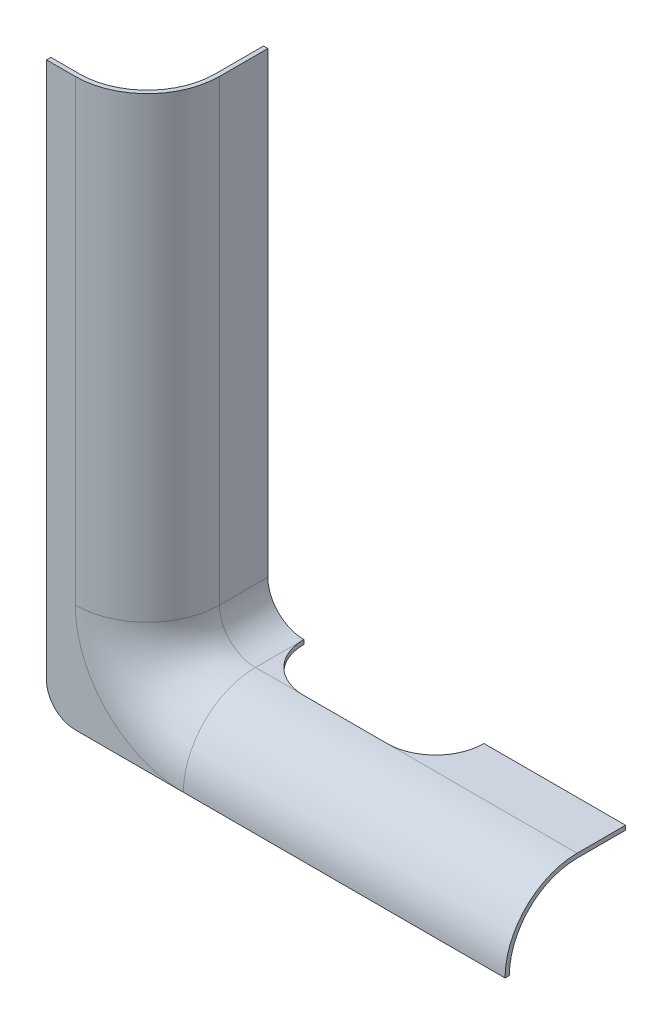
ISO-10303-21;
HEADER;
FILE_DESCRIPTION(('STEP AP214'),'2;1');
FILE_NAME('part.step','',(''),(''),'','','');
FILE_SCHEMA(('AUTOMOTIVE_DESIGN { 1 0 10303 214 1 1 1 1 }'));
ENDSEC;
DATA;
#1=APPLICATION_CONTEXT('core data for automotive mechanical design processes');
#2=APPLICATION_PROTOCOL_DEFINITION('international standard','automotive_design',2000,#1);
#3=PRODUCT_CONTEXT('',#1,'mechanical');
#4=PRODUCT('Part','Part','',(#3));
#5=PRODUCT_RELATED_PRODUCT_CATEGORY('part','',(#4));
#6=PRODUCT_DEFINITION_FORMATION('','',#4);
#7=PRODUCT_DEFINITION_CONTEXT('part definition',#1,'design');
#8=PRODUCT_DEFINITION('design','',#6,#7);
#9=PRODUCT_DEFINITION_SHAPE('','',#8);
#10=(LENGTH_UNIT() NAMED_UNIT(*) SI_UNIT(.MILLI.,.METRE.));
#11=(NAMED_UNIT(*) PLANE_ANGLE_UNIT() SI_UNIT($,.RADIAN.));
#12=(NAMED_UNIT(*) SI_UNIT($,.STERADIAN.) SOLID_ANGLE_UNIT());
#13=UNCERTAINTY_MEASURE_WITH_UNIT(LENGTH_MEASURE(1.E-05),#10,'distance_accuracy_value','');
#14=(GEOMETRIC_REPRESENTATION_CONTEXT(3) GLOBAL_UNCERTAINTY_ASSIGNED_CONTEXT((#13)) GLOBAL_UNIT_ASSIGNED_CONTEXT((#10,
#11,#12)) REPRESENTATION_CONTEXT('',''));
#15=CARTESIAN_POINT('',(0.,0.,0.));
#16=DIRECTION('',(0.,0.,1.));
#17=DIRECTION('',(1.,0.,0.));
#18=AXIS2_PLACEMENT_3D('',#15,#16,#17);
#19=CARTESIAN_POINT('',(46.5590634304441,-724.702863061255,33.4500000000002));
#20=DIRECTION('',(0.,-1.,0.));
#21=DIRECTION('',(0.,0.,-1.));
#22=AXIS2_PLACEMENT_3D('',#19,#20,#21);
#23=PLANE('',#22);
#24=DIRECTION('',(-1.,0.,0.));
#25=VECTOR('',#24,1.);
#26=CARTESIAN_POINT('',(46.5590634304441,-724.702863061255,0.));
#27=LINE('',#26,#25);
#28=CARTESIAN_POINT('',(46.5590634304441,-724.702863061255,0.));
#29=VERTEX_POINT('',#28);
#30=CARTESIAN_POINT('',(7.26848491782996,-724.702863061255,0.));
#31=VERTEX_POINT('',#30);
#32=EDGE_CURVE('E182',#29,#31,#27,.T.);
#33=ORIENTED_EDGE('',*,*,#32,.T.);
#34=CARTESIAN_POINT('',(-6.18151508217022,-724.702863061255,0.));
#35=DIRECTION('',(0.,1.,0.));
#36=DIRECTION('',(0.,0.,1.));
#37=AXIS2_PLACEMENT_3D('',#34,#35,#36);
#38=CIRCLE('',#37,13.4500000000002);
#39=CARTESIAN_POINT('',(-6.18151508217022,-724.702863061255,13.4500000000002));
#40=VERTEX_POINT('',#39);
#41=EDGE_CURVE('E162',#40,#31,#38,.T.);
#42=ORIENTED_EDGE('',*,*,#41,.F.);
#43=DIRECTION('',(-1.,0.,0.));
#44=VECTOR('',#43,1.);
#45=CARTESIAN_POINT('',(46.5590634304441,-724.702863061255,13.4500000000002));
#46=LINE('',#45,#44);
#47=CARTESIAN_POINT('',(46.5590634304441,-724.702863061255,13.4500000000002));
#48=VERTEX_POINT('',#47);
#49=EDGE_CURVE('E60',#40,#48,#46,.F.);
#50=ORIENTED_EDGE('',*,*,#49,.T.);
#51=DIRECTION('',(0.,0.,-1.));
#52=VECTOR('',#51,1.);
#53=CARTESIAN_POINT('',(46.5590634304441,-724.702863061255,33.4500000000002));
#54=LINE('',#53,#52);
#55=EDGE_CURVE('E276',#48,#29,#54,.T.);
#56=ORIENTED_EDGE('',*,*,#55,.T.);
#57=EDGE_LOOP('',(#33,#42,#50,#56));
#58=FACE_BOUND('',#57,.T.);
#59=ADVANCED_FACE('F35',(#58),#23,.F.);
#60=CARTESIAN_POINT('',(-72.73151508217,-736.702863061255,0.));
#61=DIRECTION('',(0.,0.,1.));
#62=DIRECTION('',(1.,0.,0.));
#63=AXIS2_PLACEMENT_3D('',#60,#61,#62);
#64=PLANE('',#63);
#65=DIRECTION('',(-1.,0.,0.));
#66=VECTOR('',#65,1.);
#67=CARTESIAN_POINT('',(46.5590634304441,-725.902863061255,0.));
#68=LINE('',#67,#66);
#69=CARTESIAN_POINT('',(46.5590634304441,-725.902863061255,0.));
#70=VERTEX_POINT('',#69);
#71=CARTESIAN_POINT('',(7.26848491782996,-725.902863061255,0.));
#72=VERTEX_POINT('',#71);
#73=EDGE_CURVE('E235',#70,#72,#68,.T.);
#74=ORIENTED_EDGE('',*,*,#73,.T.);
#75=DIRECTION('',(0.,1.,0.));
#76=VECTOR('',#75,1.);
#77=CARTESIAN_POINT('',(7.26848491782996,-782.679706932678,0.));
#78=LINE('',#77,#76);
#79=EDGE_CURVE('E340',#72,#31,#78,.T.);
#80=ORIENTED_EDGE('',*,*,#79,.T.);
#81=ORIENTED_EDGE('',*,*,#32,.F.);
#82=DIRECTION('',(0.,1.,0.));
#83=VECTOR('',#82,1.);
#84=CARTESIAN_POINT('',(46.5590634304441,-744.702863061255,0.));
#85=LINE('',#84,#83);
#86=EDGE_CURVE('E199',#70,#29,#85,.T.);
#87=ORIENTED_EDGE('',*,*,#86,.F.);
#88=EDGE_LOOP('',(#74,#80,#81,#87));
#89=FACE_BOUND('',#88,.T.);
#90=ADVANCED_FACE('F339',(#89),#64,.F.);
#91=CARTESIAN_POINT('',(46.5590634304441,-725.902863061255,33.4500000000002));
#92=DIRECTION('',(0.,-1.,0.));
#93=DIRECTION('',(0.,0.,-1.));
#94=AXIS2_PLACEMENT_3D('',#91,#92,#93);
#95=PLANE('',#94);
#96=CARTESIAN_POINT('',(-6.18151508217022,-725.902863061255,0.));
#97=DIRECTION('',(0.,-1.,0.));
#98=DIRECTION('',(0.,0.,-1.));
#99=AXIS2_PLACEMENT_3D('',#96,#97,#98);
#100=CIRCLE('',#99,13.4500000000002);
#101=CARTESIAN_POINT('',(-6.18151508217023,-725.902863061255,13.4500000000002));
#102=VERTEX_POINT('',#101);
#103=EDGE_CURVE('E165',#102,#72,#100,.F.);
#104=ORIENTED_EDGE('',*,*,#103,.T.);
#105=ORIENTED_EDGE('',*,*,#73,.F.);
#106=DIRECTION('',(0.,0.,-1.));
#107=VECTOR('',#106,1.);
#108=CARTESIAN_POINT('',(46.5590634304441,-725.902863061255,33.4500000000002));
#109=LINE('',#108,#107);
#110=CARTESIAN_POINT('',(46.5590634304441,-725.902863061255,13.4500000000002));
#111=VERTEX_POINT('',#110);
#112=EDGE_CURVE('E210',#111,#70,#109,.T.);
#113=ORIENTED_EDGE('',*,*,#112,.F.);
#114=DIRECTION('',(1.,0.,0.));
#115=VECTOR('',#114,1.);
#116=CARTESIAN_POINT('',(46.5590634304441,-725.902863061255,13.4500000000002));
#117=LINE('',#116,#115);
#118=EDGE_CURVE('E206',#102,#111,#117,.T.);
#119=ORIENTED_EDGE('',*,*,#118,.F.);
#120=EDGE_LOOP('',(#104,#105,#113,#119));
#121=FACE_BOUND('',#120,.T.);
#122=ADVANCED_FACE('F387',(#121),#95,.T.);
#123=CARTESIAN_POINT('',(46.5590634304441,-744.702863061255,33.4500000000002));
#124=DIRECTION('',(-1.,0.,0.));
#125=DIRECTION('',(0.,0.,1.));
#126=AXIS2_PLACEMENT_3D('',#123,#124,#125);
#127=PLANE('',#126);
#128=CARTESIAN_POINT('',(46.5590634304441,-744.702863061255,13.4500000000002));
#129=DIRECTION('',(-1.,0.,0.));
#130=DIRECTION('',(0.,0.,1.));
#131=AXIS2_PLACEMENT_3D('',#128,#129,#130);
#132=CIRCLE('',#131,18.8);
#133=CARTESIAN_POINT('',(46.5590634304441,-744.702863061255,32.2500000000002));
#134=VERTEX_POINT('',#133);
#135=EDGE_CURVE('E193',#111,#134,#132,.F.);
#136=ORIENTED_EDGE('',*,*,#135,.F.);
#137=ORIENTED_EDGE('',*,*,#112,.T.);
#138=ORIENTED_EDGE('',*,*,#86,.T.);
#139=ORIENTED_EDGE('',*,*,#55,.F.);
#140=CARTESIAN_POINT('',(46.5590634304441,-744.702863061255,13.4500000000002));
#141=DIRECTION('',(-1.,0.,0.));
#142=DIRECTION('',(0.,0.,1.));
#143=AXIS2_PLACEMENT_3D('',#140,#141,#142);
#144=CIRCLE('',#143,20.);
#145=CARTESIAN_POINT('',(46.5590634304441,-744.702863061255,33.4500000000002));
#146=VERTEX_POINT('',#145);
#147=EDGE_CURVE('E11',#48,#146,#144,.F.);
#148=ORIENTED_EDGE('',*,*,#147,.T.);
#149=DIRECTION('',(0.,0.,-1.));
#150=VECTOR('',#149,1.);
#151=CARTESIAN_POINT('',(46.5590634304441,-744.702863061255,33.4500000000002));
#152=LINE('',#151,#150);
#153=EDGE_CURVE('E255',#146,#134,#152,.T.);
#154=ORIENTED_EDGE('',*,*,#153,.T.);
#155=EDGE_LOOP('',(#136,#137,#138,#139,#148,#154));
#156=FACE_BOUND('',#155,.T.);
#157=ADVANCED_FACE('F335',(#156),#127,.F.);
#158=CARTESIAN_POINT('',(-42.73151508217,-724.702863061255,13.4500000000002));
#159=VERTEX_POINT('',#158);
#160=CARTESIAN_POINT('',(-29.2815150821699,-724.702863061255,13.4500000000002));
#161=VERTEX_POINT('',#160);
#162=EDGE_CURVE('E44',#159,#161,#46,.F.);
#163=ORIENTED_EDGE('',*,*,#162,.T.);
#164=CARTESIAN_POINT('',(-29.2815150821699,-724.702863061255,0.));
#165=DIRECTION('',(0.,1.,0.));
#166=DIRECTION('',(0.,0.,1.));
#167=AXIS2_PLACEMENT_3D('',#164,#165,#166);
#168=CIRCLE('',#167,13.4500000000002);
#169=CARTESIAN_POINT('',(-42.73151508217,-724.702863061255,0.));
#170=VERTEX_POINT('',#169);
#171=EDGE_CURVE('E178',#170,#161,#168,.T.);
#172=ORIENTED_EDGE('',*,*,#171,.F.);
#173=DIRECTION('',(0.,0.,-1.));
#174=VECTOR('',#173,1.);
#175=CARTESIAN_POINT('',(-42.73151508217,-724.702863061255,33.4500000000002));
#176=LINE('',#175,#174);
#177=EDGE_CURVE('E280',#170,#159,#176,.F.);
#178=ORIENTED_EDGE('',*,*,#177,.T.);
#179=EDGE_LOOP('',(#163,#172,#178));
#180=FACE_BOUND('',#179,.T.);
#181=ADVANCED_FACE('F308',(#180),#23,.F.);
#182=CARTESIAN_POINT('',(-52.73151508217,-724.702863061255,33.4500000000002));
#183=DIRECTION('',(-1.,0.,0.));
#184=DIRECTION('',(0.,0.,1.));
#185=AXIS2_PLACEMENT_3D('',#182,#183,#184);
#186=PLANE('',#185);
#187=DIRECTION('',(0.,0.,-1.));
#188=VECTOR('',#187,1.);
#189=CARTESIAN_POINT('',(-52.73151508217,-587.62723977428,33.4500000000002));
#190=LINE('',#189,#188);
#191=CARTESIAN_POINT('',(-52.73151508217,-587.62723977428,13.4500000000002));
#192=VERTEX_POINT('',#191);
#193=CARTESIAN_POINT('',(-52.73151508217,-587.62723977428,0.));
#194=VERTEX_POINT('',#193);
#195=EDGE_CURVE('E274',#192,#194,#190,.T.);
#196=ORIENTED_EDGE('',*,*,#195,.F.);
#197=DIRECTION('',(0.,1.,0.));
#198=VECTOR('',#197,1.);
#199=CARTESIAN_POINT('',(-52.73151508217,-714.702863061255,13.4500000000002));
#200=LINE('',#199,#198);
#201=CARTESIAN_POINT('',(-52.73151508217,-714.702863061255,13.4500000000002));
#202=VERTEX_POINT('',#201);
#203=EDGE_CURVE('E188',#192,#202,#200,.F.);
#204=ORIENTED_EDGE('',*,*,#203,.T.);
#205=DIRECTION('',(0.,0.,-1.));
#206=VECTOR('',#205,1.);
#207=CARTESIAN_POINT('',(-52.73151508217,-714.702863061255,0.));
#208=LINE('',#207,#206);
#209=CARTESIAN_POINT('',(-52.73151508217,-714.702863061255,0.));
#210=VERTEX_POINT('',#209);
#211=EDGE_CURVE('E278',#202,#210,#208,.T.);
#212=ORIENTED_EDGE('',*,*,#211,.T.);
#213=DIRECTION('',(0.,1.,0.));
#214=VECTOR('',#213,1.);
#215=CARTESIAN_POINT('',(-52.73151508217,-724.702863061255,0.));
#216=LINE('',#215,#214);
#217=EDGE_CURVE('E258',#210,#194,#216,.T.);
#218=ORIENTED_EDGE('',*,*,#217,.T.);
#219=EDGE_LOOP('',(#196,#204,#212,#218));
#220=FACE_BOUND('',#219,.T.);
#221=ADVANCED_FACE('F295',(#220),#186,.F.);
#222=CARTESIAN_POINT('',(-80.73151508217,-587.62723977428,33.4500000000002));
#223=DIRECTION('',(0.,-1.,0.));
#224=DIRECTION('',(0.,0.,-1.));
#225=AXIS2_PLACEMENT_3D('',#222,#223,#224);
#226=PLANE('',#225);
#227=CARTESIAN_POINT('',(-72.73151508217,-587.62723977428,13.4500000000002));
#228=DIRECTION('',(0.,-1.,0.));
#229=DIRECTION('',(0.,0.,-1.));
#230=AXIS2_PLACEMENT_3D('',#227,#228,#229);
#231=CIRCLE('',#230,18.8);
#232=CARTESIAN_POINT('',(-72.73151508217,-587.62723977428,32.2500000000002));
#233=VERTEX_POINT('',#232);
#234=CARTESIAN_POINT('',(-53.93151508217,-587.62723977428,13.4500000000002));
#235=VERTEX_POINT('',#234);
#236=EDGE_CURVE('E228',#233,#235,#231,.F.);
#237=ORIENTED_EDGE('',*,*,#236,.F.);
#238=DIRECTION('',(-1.,0.,0.));
#239=VECTOR('',#238,1.);
#240=CARTESIAN_POINT('',(-80.73151508217,-587.62723977428,32.2500000000002));
#241=LINE('',#240,#239);
#242=CARTESIAN_POINT('',(-80.73151508217,-587.62723977428,32.2500000000002));
#243=VERTEX_POINT('',#242);
#244=EDGE_CURVE('E224',#233,#243,#241,.T.);
#245=ORIENTED_EDGE('',*,*,#244,.T.);
#246=DIRECTION('',(0.,0.,-1.));
#247=VECTOR('',#246,1.);
#248=CARTESIAN_POINT('',(-80.73151508217,-587.62723977428,33.4500000000002));
#249=LINE('',#248,#247);
#250=CARTESIAN_POINT('',(-80.73151508217,-587.62723977428,33.4500000000002));
#251=VERTEX_POINT('',#250);
#252=EDGE_CURVE('E271',#251,#243,#249,.T.);
#253=ORIENTED_EDGE('',*,*,#252,.F.);
#254=DIRECTION('',(-1.,0.,0.));
#255=VECTOR('',#254,1.);
#256=CARTESIAN_POINT('',(-80.73151508217,-587.62723977428,33.4500000000002));
#257=LINE('',#256,#255);
#258=CARTESIAN_POINT('',(-72.73151508217,-587.62723977428,33.4500000000002));
#259=VERTEX_POINT('',#258);
#260=EDGE_CURVE('E244',#259,#251,#257,.T.);
#261=ORIENTED_EDGE('',*,*,#260,.F.);
#262=CARTESIAN_POINT('',(-72.73151508217,-587.62723977428,13.4500000000002));
#263=DIRECTION('',(0.,-1.,0.));
#264=DIRECTION('',(0.,0.,-1.));
#265=AXIS2_PLACEMENT_3D('',#262,#263,#264);
#266=CIRCLE('',#265,20.);
#267=EDGE_CURVE('E291',#259,#192,#266,.F.);
#268=ORIENTED_EDGE('',*,*,#267,.T.);
#269=ORIENTED_EDGE('',*,*,#195,.T.);
#270=DIRECTION('',(-1.,0.,0.));
#271=VECTOR('',#270,1.);
#272=CARTESIAN_POINT('',(-80.73151508217,-587.62723977428,0.));
#273=LINE('',#272,#271);
#274=CARTESIAN_POINT('',(-53.93151508217,-587.62723977428,0.));
#275=VERTEX_POINT('',#274);
#276=EDGE_CURVE('E247',#194,#275,#273,.T.);
#277=ORIENTED_EDGE('',*,*,#276,.T.);
#278=DIRECTION('',(0.,0.,-1.));
#279=VECTOR('',#278,1.);
#280=CARTESIAN_POINT('',(-53.93151508217,-587.62723977428,33.4500000000002));
#281=LINE('',#280,#279);
#282=EDGE_CURVE('E218',#235,#275,#281,.T.);
#283=ORIENTED_EDGE('',*,*,#282,.F.);
#284=EDGE_LOOP('',(#237,#245,#253,#261,#268,#269,#277,#283));
#285=FACE_BOUND('',#284,.T.);
#286=ADVANCED_FACE('F322',(#285),#226,.F.);
#287=CARTESIAN_POINT('',(-80.73151508217,-736.702863061255,33.4500000000002));
#288=DIRECTION('',(1.,0.,0.));
#289=DIRECTION('',(0.,0.,-1.));
#290=AXIS2_PLACEMENT_3D('',#287,#288,#289);
#291=PLANE('',#290);
#292=ORIENTED_EDGE('',*,*,#252,.T.);
#293=DIRECTION('',(0.,-1.,0.));
#294=VECTOR('',#293,1.);
#295=CARTESIAN_POINT('',(-80.73151508217,-736.702863061255,32.2500000000002));
#296=LINE('',#295,#294);
#297=CARTESIAN_POINT('',(-80.73151508217,-736.702863061255,32.2500000000002));
#298=VERTEX_POINT('',#297);
#299=EDGE_CURVE('E221',#243,#298,#296,.T.);
#300=ORIENTED_EDGE('',*,*,#299,.T.);
#301=DIRECTION('',(0.,0.,-1.));
#302=VECTOR('',#301,1.);
#303=CARTESIAN_POINT('',(-80.73151508217,-736.702863061255,33.4500000000002));
#304=LINE('',#303,#302);
#305=CARTESIAN_POINT('',(-80.73151508217,-736.702863061255,33.4500000000002));
#306=VERTEX_POINT('',#305);
#307=EDGE_CURVE('E268',#306,#298,#304,.T.);
#308=ORIENTED_EDGE('',*,*,#307,.F.);
#309=DIRECTION('',(0.,-1.,0.));
#310=VECTOR('',#309,1.);
#311=CARTESIAN_POINT('',(-80.73151508217,-736.702863061255,33.4500000000002));
#312=LINE('',#311,#310);
#313=EDGE_CURVE('E246',#251,#306,#312,.T.);
#314=ORIENTED_EDGE('',*,*,#313,.F.);
#315=EDGE_LOOP('',(#292,#300,#308,#314));
#316=FACE_BOUND('',#315,.T.);
#317=ADVANCED_FACE('F368',(#316),#291,.F.);
#318=CARTESIAN_POINT('',(-72.73151508217,-736.702863061255,33.4500000000002));
#319=DIRECTION('',(0.,0.,-1.));
#320=DIRECTION('',(-1.,0.,0.));
#321=AXIS2_PLACEMENT_3D('',#318,#319,#320);
#322=CYLINDRICAL_SURFACE('',#321,8.);
#323=ORIENTED_EDGE('',*,*,#307,.T.);
#324=CARTESIAN_POINT('',(-72.73151508217,-736.702863061255,32.2500000000002));
#325=DIRECTION('',(0.,0.,1.));
#326=DIRECTION('',(1.,0.,0.));
#327=AXIS2_PLACEMENT_3D('',#324,#325,#326);
#328=CIRCLE('',#327,8.);
#329=CARTESIAN_POINT('',(-72.7315150821701,-744.702863061255,32.2500000000002));
#330=VERTEX_POINT('',#329);
#331=EDGE_CURVE('E215',#298,#330,#328,.T.);
#332=ORIENTED_EDGE('',*,*,#331,.T.);
#333=DIRECTION('',(0.,0.,-1.));
#334=VECTOR('',#333,1.);
#335=CARTESIAN_POINT('',(-72.7315150821701,-744.702863061255,33.4500000000002));
#336=LINE('',#335,#334);
#337=CARTESIAN_POINT('',(-72.7315150821701,-744.702863061255,33.4500000000002));
#338=VERTEX_POINT('',#337);
#339=EDGE_CURVE('E265',#338,#330,#336,.T.);
#340=ORIENTED_EDGE('',*,*,#339,.F.);
#341=CARTESIAN_POINT('',(-72.73151508217,-736.702863061255,33.4500000000002));
#342=DIRECTION('',(0.,0.,1.));
#343=DIRECTION('',(1.,0.,0.));
#344=AXIS2_PLACEMENT_3D('',#341,#342,#343);
#345=CIRCLE('',#344,8.);
#346=EDGE_CURVE('E249',#306,#338,#345,.T.);
#347=ORIENTED_EDGE('',*,*,#346,.F.);
#348=EDGE_LOOP('',(#323,#332,#340,#347));
#349=FACE_BOUND('',#348,.T.);
#350=ADVANCED_FACE('F371',(#349),#322,.T.);
#351=CARTESIAN_POINT('',(46.5590634304441,-744.702863061255,33.4500000000002));
#352=DIRECTION('',(0.,1.,0.));
#353=DIRECTION('',(0.,0.,1.));
#354=AXIS2_PLACEMENT_3D('',#351,#352,#353);
#355=PLANE('',#354);
#356=DIRECTION('',(1.,0.,0.));
#357=VECTOR('',#356,1.);
#358=CARTESIAN_POINT('',(46.5590634304441,-744.702863061255,32.2500000000002));
#359=LINE('',#358,#357);
#360=CARTESIAN_POINT('',(-42.73151508217,-744.702863061255,32.2500000000002));
#361=VERTEX_POINT('',#360);
#362=EDGE_CURVE('E214',#330,#361,#359,.T.);
#363=ORIENTED_EDGE('',*,*,#362,.T.);
#364=DIRECTION('',(1.,0.,0.));
#365=VECTOR('',#364,1.);
#366=CARTESIAN_POINT('',(-42.73151508217,-744.702863061255,32.2500000000002));
#367=LINE('',#366,#365);
#368=EDGE_CURVE('E212',#361,#134,#367,.T.);
#369=ORIENTED_EDGE('',*,*,#368,.T.);
#370=ORIENTED_EDGE('',*,*,#153,.F.);
#371=DIRECTION('',(1.,0.,0.));
#372=VECTOR('',#371,1.);
#373=CARTESIAN_POINT('',(46.5590634304441,-744.702863061255,33.4500000000002));
#374=LINE('',#373,#372);
#375=CARTESIAN_POINT('',(-42.73151508217,-744.702863061255,33.4500000000002));
#376=VERTEX_POINT('',#375);
#377=EDGE_CURVE('E251',#376,#146,#374,.T.);
#378=ORIENTED_EDGE('',*,*,#377,.F.);
#379=EDGE_CURVE('E252',#338,#376,#374,.T.);
#380=ORIENTED_EDGE('',*,*,#379,.F.);
#381=ORIENTED_EDGE('',*,*,#339,.T.);
#382=EDGE_LOOP('',(#363,#369,#370,#378,#380,#381));
#383=FACE_BOUND('',#382,.T.);
#384=ADVANCED_FACE('F332',(#383),#355,.F.);
#385=CARTESIAN_POINT('',(-72.73151508217,-736.702863061255,33.4500000000002));
#386=DIRECTION('',(0.,0.,1.));
#387=DIRECTION('',(1.,0.,0.));
#388=AXIS2_PLACEMENT_3D('',#385,#386,#387);
#389=PLANE('',#388);
#390=CARTESIAN_POINT('',(-42.73151508217,-714.702863061255,33.4500000000002));
#391=DIRECTION('',(0.,0.,1.));
#392=DIRECTION('',(1.,0.,0.));
#393=AXIS2_PLACEMENT_3D('',#390,#391,#392);
#394=CIRCLE('',#393,30.);
#395=CARTESIAN_POINT('',(-72.73151508217,-714.702863061255,33.4500000000002));
#396=VERTEX_POINT('',#395);
#397=EDGE_CURVE('E286',#376,#396,#394,.F.);
#398=ORIENTED_EDGE('',*,*,#397,.T.);
#399=DIRECTION('',(0.,1.,0.));
#400=VECTOR('',#399,1.);
#401=CARTESIAN_POINT('',(-72.73151508217,-587.62723977428,33.4500000000002));
#402=LINE('',#401,#400);
#403=EDGE_CURVE('E288',#396,#259,#402,.T.);
#404=ORIENTED_EDGE('',*,*,#403,.T.);
#405=ORIENTED_EDGE('',*,*,#260,.T.);
#406=ORIENTED_EDGE('',*,*,#313,.T.);
#407=ORIENTED_EDGE('',*,*,#346,.T.);
#408=ORIENTED_EDGE('',*,*,#379,.T.);
#409=EDGE_LOOP('',(#398,#404,#405,#406,#407,#408));
#410=FACE_BOUND('',#409,.T.);
#411=ADVANCED_FACE('F327',(#410),#389,.T.);
#412=CARTESIAN_POINT('',(-42.73151508217,-714.702863061255,0.));
#413=DIRECTION('',(0.,0.,1.));
#414=DIRECTION('',(1.,0.,0.));
#415=AXIS2_PLACEMENT_3D('',#412,#413,#414);
#416=CIRCLE('',#415,10.);
#417=EDGE_CURVE('E283',#210,#170,#416,.T.);
#418=ORIENTED_EDGE('',*,*,#417,.T.);
#419=DIRECTION('',(0.,1.,0.));
#420=VECTOR('',#419,1.);
#421=CARTESIAN_POINT('',(-42.73151508217,-782.679706932678,0.));
#422=LINE('',#421,#420);
#423=CARTESIAN_POINT('',(-42.73151508217,-725.902863061255,0.));
#424=VERTEX_POINT('',#423);
#425=EDGE_CURVE('E315',#170,#424,#422,.F.);
#426=ORIENTED_EDGE('',*,*,#425,.T.);
#427=CARTESIAN_POINT('',(-42.73151508217,-714.702863061255,0.));
#428=DIRECTION('',(0.,0.,1.));
#429=DIRECTION('',(1.,0.,0.));
#430=AXIS2_PLACEMENT_3D('',#427,#428,#429);
#431=CIRCLE('',#430,11.2);
#432=CARTESIAN_POINT('',(-53.93151508217,-714.702863061255,0.));
#433=VERTEX_POINT('',#432);
#434=EDGE_CURVE('E236',#433,#424,#431,.T.);
#435=ORIENTED_EDGE('',*,*,#434,.F.);
#436=DIRECTION('',(0.,1.,0.));
#437=VECTOR('',#436,1.);
#438=CARTESIAN_POINT('',(-53.93151508217,-724.702863061255,0.));
#439=LINE('',#438,#437);
#440=EDGE_CURVE('E227',#433,#275,#439,.T.);
#441=ORIENTED_EDGE('',*,*,#440,.T.);
#442=ORIENTED_EDGE('',*,*,#276,.F.);
#443=ORIENTED_EDGE('',*,*,#217,.F.);
#444=EDGE_LOOP('',(#418,#426,#435,#441,#442,#443));
#445=FACE_BOUND('',#444,.T.);
#446=ADVANCED_FACE('F313',(#445),#64,.F.);
#447=CARTESIAN_POINT('',(-42.73151508217,-714.702863061255,33.4500000000002));
#448=DIRECTION('',(0.,0.,1.));
#449=DIRECTION('',(1.,0.,0.));
#450=AXIS2_PLACEMENT_3D('',#447,#448,#449);
#451=CYLINDRICAL_SURFACE('',#450,10.);
#452=ORIENTED_EDGE('',*,*,#211,.F.);
#453=CARTESIAN_POINT('',(-42.73151508217,-714.702863061255,13.4500000000002));
#454=DIRECTION('',(0.,0.,1.));
#455=DIRECTION('',(1.,0.,0.));
#456=AXIS2_PLACEMENT_3D('',#453,#454,#455);
#457=CIRCLE('',#456,10.);
#458=EDGE_CURVE('E186',#202,#159,#457,.T.);
#459=ORIENTED_EDGE('',*,*,#458,.T.);
#460=ORIENTED_EDGE('',*,*,#177,.F.);
#461=ORIENTED_EDGE('',*,*,#417,.F.);
#462=EDGE_LOOP('',(#452,#459,#460,#461));
#463=FACE_BOUND('',#462,.T.);
#464=ADVANCED_FACE('F299',(#463),#451,.F.);
#465=CARTESIAN_POINT('',(-72.73151508217,-744.702863061255,13.4500000000002));
#466=DIRECTION('',(1.,0.,0.));
#467=DIRECTION('',(0.,0.,-1.));
#468=AXIS2_PLACEMENT_3D('',#465,#466,#467);
#469=CYLINDRICAL_SURFACE('',#468,20.);
#470=ORIENTED_EDGE('',*,*,#147,.F.);
#471=ORIENTED_EDGE('',*,*,#49,.F.);
#472=DIRECTION('',(1.,0.,0.));
#473=VECTOR('',#472,1.);
#474=CARTESIAN_POINT('',(-29.2815150821699,-724.702863061255,13.4500000000002));
#475=LINE('',#474,#473);
#476=EDGE_CURVE('E171',#161,#40,#475,.T.);
#477=ORIENTED_EDGE('',*,*,#476,.F.);
#478=ORIENTED_EDGE('',*,*,#162,.F.);
#479=CARTESIAN_POINT('',(-42.73151508217,-744.702863061255,13.4500000000002));
#480=DIRECTION('',(-1.,0.,0.));
#481=DIRECTION('',(0.,0.,1.));
#482=AXIS2_PLACEMENT_3D('',#479,#480,#481);
#483=CIRCLE('',#482,20.);
#484=EDGE_CURVE('E39',#376,#159,#483,.T.);
#485=ORIENTED_EDGE('',*,*,#484,.F.);
#486=ORIENTED_EDGE('',*,*,#377,.T.);
#487=EDGE_LOOP('',(#470,#471,#477,#478,#485,#486));
#488=FACE_BOUND('',#487,.T.);
#489=ADVANCED_FACE('F37',(#488),#469,.T.);
#490=CARTESIAN_POINT('',(-42.73151508217,-714.702863061255,13.4500000000002));
#491=DIRECTION('',(0.,0.,1.));
#492=DIRECTION('',(1.,0.,0.));
#493=AXIS2_PLACEMENT_3D('',#490,#491,#492);
#494=TOROIDAL_SURFACE('',#493,30.,20.);
#495=ORIENTED_EDGE('',*,*,#484,.T.);
#496=ORIENTED_EDGE('',*,*,#458,.F.);
#497=CARTESIAN_POINT('',(-72.73151508217,-714.702863061255,13.4500000000002));
#498=DIRECTION('',(0.,1.,0.));
#499=DIRECTION('',(0.,0.,1.));
#500=AXIS2_PLACEMENT_3D('',#497,#498,#499);
#501=CIRCLE('',#500,20.);
#502=EDGE_CURVE('E191',#396,#202,#501,.T.);
#503=ORIENTED_EDGE('',*,*,#502,.F.);
#504=ORIENTED_EDGE('',*,*,#397,.F.);
#505=EDGE_LOOP('',(#495,#496,#503,#504));
#506=FACE_BOUND('',#505,.T.);
#507=ADVANCED_FACE('F303',(#506),#494,.T.);
#508=CARTESIAN_POINT('',(-72.73151508217,-736.702863061255,13.4500000000002));
#509=DIRECTION('',(0.,-1.,0.));
#510=DIRECTION('',(0.,0.,-1.));
#511=AXIS2_PLACEMENT_3D('',#508,#509,#510);
#512=CYLINDRICAL_SURFACE('',#511,20.);
#513=ORIENTED_EDGE('',*,*,#502,.T.);
#514=ORIENTED_EDGE('',*,*,#203,.F.);
#515=ORIENTED_EDGE('',*,*,#267,.F.);
#516=ORIENTED_EDGE('',*,*,#403,.F.);
#517=EDGE_LOOP('',(#513,#514,#515,#516));
#518=FACE_BOUND('',#517,.T.);
#519=ADVANCED_FACE('F325',(#518),#512,.T.);
#520=CARTESIAN_POINT('',(-29.2815150821699,-725.902863061255,0.));
#521=DIRECTION('',(0.,-1.,0.));
#522=DIRECTION('',(0.,0.,-1.));
#523=AXIS2_PLACEMENT_3D('',#520,#521,#522);
#524=CIRCLE('',#523,13.4500000000002);
#525=CARTESIAN_POINT('',(-29.2815150821699,-725.902863061255,13.4500000000002));
#526=VERTEX_POINT('',#525);
#527=EDGE_CURVE('E382',#424,#526,#524,.F.);
#528=ORIENTED_EDGE('',*,*,#527,.T.);
#529=CARTESIAN_POINT('',(-42.73151508217,-725.902863061255,13.4500000000002));
#530=VERTEX_POINT('',#529);
#531=EDGE_CURVE('E200',#530,#526,#117,.T.);
#532=ORIENTED_EDGE('',*,*,#531,.F.);
#533=DIRECTION('',(0.,0.,-1.));
#534=VECTOR('',#533,1.);
#535=CARTESIAN_POINT('',(-42.73151508217,-725.902863061255,33.4500000000002));
#536=LINE('',#535,#534);
#537=EDGE_CURVE('E240',#424,#530,#536,.F.);
#538=ORIENTED_EDGE('',*,*,#537,.F.);
#539=EDGE_LOOP('',(#528,#532,#538));
#540=FACE_BOUND('',#539,.T.);
#541=ADVANCED_FACE('F381',(#540),#95,.T.);
#542=CARTESIAN_POINT('',(-53.93151508217,-724.702863061255,33.4500000000002));
#543=DIRECTION('',(-1.,0.,0.));
#544=DIRECTION('',(0.,0.,1.));
#545=AXIS2_PLACEMENT_3D('',#542,#543,#544);
#546=PLANE('',#545);
#547=ORIENTED_EDGE('',*,*,#282,.T.);
#548=ORIENTED_EDGE('',*,*,#440,.F.);
#549=DIRECTION('',(0.,0.,1.));
#550=VECTOR('',#549,1.);
#551=CARTESIAN_POINT('',(-53.93151508217,-714.702863061255,33.4500000000002));
#552=LINE('',#551,#550);
#553=CARTESIAN_POINT('',(-53.93151508217,-714.702863061255,13.4500000000002));
#554=VERTEX_POINT('',#553);
#555=EDGE_CURVE('E349',#554,#433,#552,.F.);
#556=ORIENTED_EDGE('',*,*,#555,.F.);
#557=DIRECTION('',(0.,1.,0.));
#558=VECTOR('',#557,1.);
#559=CARTESIAN_POINT('',(-53.93151508217,-724.702863061255,13.4500000000002));
#560=LINE('',#559,#558);
#561=EDGE_CURVE('E230',#235,#554,#560,.F.);
#562=ORIENTED_EDGE('',*,*,#561,.F.);
#563=EDGE_LOOP('',(#547,#548,#556,#562));
#564=FACE_BOUND('',#563,.T.);
#565=ADVANCED_FACE('F400',(#564),#546,.T.);
#566=CARTESIAN_POINT('',(-72.73151508217,-736.702863061255,32.2500000000002));
#567=DIRECTION('',(0.,0.,1.));
#568=DIRECTION('',(1.,0.,0.));
#569=AXIS2_PLACEMENT_3D('',#566,#567,#568);
#570=PLANE('',#569);
#571=CARTESIAN_POINT('',(-42.73151508217,-714.702863061255,32.2500000000002));
#572=DIRECTION('',(0.,0.,1.));
#573=DIRECTION('',(1.,0.,0.));
#574=AXIS2_PLACEMENT_3D('',#571,#572,#573);
#575=CIRCLE('',#574,30.);
#576=CARTESIAN_POINT('',(-72.73151508217,-714.702863061255,32.2500000000002));
#577=VERTEX_POINT('',#576);
#578=EDGE_CURVE('E239',#361,#577,#575,.F.);
#579=ORIENTED_EDGE('',*,*,#578,.F.);
#580=ORIENTED_EDGE('',*,*,#362,.F.);
#581=ORIENTED_EDGE('',*,*,#331,.F.);
#582=ORIENTED_EDGE('',*,*,#299,.F.);
#583=ORIENTED_EDGE('',*,*,#244,.F.);
#584=DIRECTION('',(0.,1.,0.));
#585=VECTOR('',#584,1.);
#586=CARTESIAN_POINT('',(-72.73151508217,-736.702863061255,32.2500000000002));
#587=LINE('',#586,#585);
#588=EDGE_CURVE('E231',#577,#233,#587,.T.);
#589=ORIENTED_EDGE('',*,*,#588,.F.);
#590=EDGE_LOOP('',(#579,#580,#581,#582,#583,#589));
#591=FACE_BOUND('',#590,.T.);
#592=ADVANCED_FACE('F365',(#591),#570,.F.);
#593=CARTESIAN_POINT('',(-42.73151508217,-714.702863061255,33.4500000000002));
#594=DIRECTION('',(0.,0.,1.));
#595=DIRECTION('',(1.,0.,0.));
#596=AXIS2_PLACEMENT_3D('',#593,#594,#595);
#597=CYLINDRICAL_SURFACE('',#596,11.2);
#598=ORIENTED_EDGE('',*,*,#555,.T.);
#599=ORIENTED_EDGE('',*,*,#434,.T.);
#600=ORIENTED_EDGE('',*,*,#537,.T.);
#601=CARTESIAN_POINT('',(-42.73151508217,-714.702863061255,13.4500000000002));
#602=DIRECTION('',(0.,0.,1.));
#603=DIRECTION('',(1.,0.,0.));
#604=AXIS2_PLACEMENT_3D('',#601,#602,#603);
#605=CIRCLE('',#604,11.2);
#606=EDGE_CURVE('E352',#554,#530,#605,.T.);
#607=ORIENTED_EDGE('',*,*,#606,.F.);
#608=EDGE_LOOP('',(#598,#599,#600,#607));
#609=FACE_BOUND('',#608,.T.);
#610=ADVANCED_FACE('F430',(#609),#597,.T.);
#611=CARTESIAN_POINT('',(-72.73151508217,-744.702863061255,13.4500000000002));
#612=DIRECTION('',(1.,0.,0.));
#613=DIRECTION('',(0.,0.,-1.));
#614=AXIS2_PLACEMENT_3D('',#611,#612,#613);
#615=CYLINDRICAL_SURFACE('',#614,18.8);
#616=ORIENTED_EDGE('',*,*,#135,.T.);
#617=ORIENTED_EDGE('',*,*,#368,.F.);
#618=CARTESIAN_POINT('',(-42.73151508217,-744.702863061255,13.4500000000002));
#619=DIRECTION('',(-1.,0.,0.));
#620=DIRECTION('',(0.,-1.,0.));
#621=AXIS2_PLACEMENT_3D('',#618,#619,#620);
#622=CIRCLE('',#621,18.8);
#623=EDGE_CURVE('E243',#361,#530,#622,.T.);
#624=ORIENTED_EDGE('',*,*,#623,.T.);
#625=ORIENTED_EDGE('',*,*,#531,.T.);
#626=DIRECTION('',(1.,0.,0.));
#627=VECTOR('',#626,1.);
#628=CARTESIAN_POINT('',(-29.2815150821699,-725.902863061255,13.4500000000002));
#629=LINE('',#628,#627);
#630=EDGE_CURVE('E167',#526,#102,#629,.T.);
#631=ORIENTED_EDGE('',*,*,#630,.T.);
#632=ORIENTED_EDGE('',*,*,#118,.T.);
#633=EDGE_LOOP('',(#616,#617,#624,#625,#631,#632));
#634=FACE_BOUND('',#633,.T.);
#635=ADVANCED_FACE('F376',(#634),#615,.F.);
#636=CARTESIAN_POINT('',(-42.73151508217,-714.702863061255,13.4500000000002));
#637=DIRECTION('',(0.,0.,1.));
#638=DIRECTION('',(1.,0.,0.));
#639=AXIS2_PLACEMENT_3D('',#636,#637,#638);
#640=TOROIDAL_SURFACE('',#639,30.,18.8);
#641=ORIENTED_EDGE('',*,*,#623,.F.);
#642=ORIENTED_EDGE('',*,*,#578,.T.);
#643=CARTESIAN_POINT('',(-72.73151508217,-714.702863061255,13.4500000000002));
#644=DIRECTION('',(0.,-1.,0.));
#645=DIRECTION('',(0.,0.,-1.));
#646=AXIS2_PLACEMENT_3D('',#643,#644,#645);
#647=CIRCLE('',#646,18.8);
#648=EDGE_CURVE('E341',#577,#554,#647,.F.);
#649=ORIENTED_EDGE('',*,*,#648,.T.);
#650=ORIENTED_EDGE('',*,*,#606,.T.);
#651=EDGE_LOOP('',(#641,#642,#649,#650));
#652=FACE_BOUND('',#651,.T.);
#653=ADVANCED_FACE('F374',(#652),#640,.F.);
#654=CARTESIAN_POINT('',(-72.73151508217,-736.702863061255,13.4500000000002));
#655=DIRECTION('',(0.,-1.,0.));
#656=DIRECTION('',(0.,0.,-1.));
#657=AXIS2_PLACEMENT_3D('',#654,#655,#656);
#658=CYLINDRICAL_SURFACE('',#657,18.8);
#659=ORIENTED_EDGE('',*,*,#648,.F.);
#660=ORIENTED_EDGE('',*,*,#588,.T.);
#661=ORIENTED_EDGE('',*,*,#236,.T.);
#662=ORIENTED_EDGE('',*,*,#561,.T.);
#663=EDGE_LOOP('',(#659,#660,#661,#662));
#664=FACE_BOUND('',#663,.T.);
#665=ADVANCED_FACE('F361',(#664),#658,.F.);
#666=CARTESIAN_POINT('',(-6.18151508217022,-782.679706932678,0.));
#667=DIRECTION('',(0.,1.,0.));
#668=DIRECTION('',(0.,0.,1.));
#669=AXIS2_PLACEMENT_3D('',#666,#667,#668);
#670=CYLINDRICAL_SURFACE('',#669,13.4500000000002);
#671=ORIENTED_EDGE('',*,*,#103,.F.);
#672=DIRECTION('',(0.,1.,0.));
#673=VECTOR('',#672,1.);
#674=CARTESIAN_POINT('',(-6.18151508217022,-782.679706932678,13.4500000000002));
#675=LINE('',#674,#673);
#676=EDGE_CURVE('E52',#102,#40,#675,.T.);
#677=ORIENTED_EDGE('',*,*,#676,.T.);
#678=ORIENTED_EDGE('',*,*,#41,.T.);
#679=ORIENTED_EDGE('',*,*,#79,.F.);
#680=EDGE_LOOP('',(#671,#677,#678,#679));
#681=FACE_BOUND('',#680,.T.);
#682=ADVANCED_FACE('F161',(#681),#670,.F.);
#683=CARTESIAN_POINT('',(-29.2815150821699,-782.679706932678,0.));
#684=DIRECTION('',(0.,1.,0.));
#685=DIRECTION('',(0.,0.,1.));
#686=AXIS2_PLACEMENT_3D('',#683,#684,#685);
#687=CYLINDRICAL_SURFACE('',#686,13.4500000000002);
#688=ORIENTED_EDGE('',*,*,#171,.T.);
#689=DIRECTION('',(0.,1.,0.));
#690=VECTOR('',#689,1.);
#691=CARTESIAN_POINT('',(-29.2815150821699,-782.679706932678,13.4500000000002));
#692=LINE('',#691,#690);
#693=EDGE_CURVE('E174',#526,#161,#692,.T.);
#694=ORIENTED_EDGE('',*,*,#693,.F.);
#695=ORIENTED_EDGE('',*,*,#527,.F.);
#696=ORIENTED_EDGE('',*,*,#425,.F.);
#697=EDGE_LOOP('',(#688,#694,#695,#696));
#698=FACE_BOUND('',#697,.T.);
#699=ADVANCED_FACE('F470',(#698),#687,.F.);
#700=CARTESIAN_POINT('',(-29.2815150821699,-782.679706932678,13.4500000000002));
#701=DIRECTION('',(0.,0.,1.));
#702=DIRECTION('',(1.,0.,0.));
#703=AXIS2_PLACEMENT_3D('',#700,#701,#702);
#704=PLANE('',#703);
#705=ORIENTED_EDGE('',*,*,#693,.T.);
#706=ORIENTED_EDGE('',*,*,#476,.T.);
#707=ORIENTED_EDGE('',*,*,#676,.F.);
#708=ORIENTED_EDGE('',*,*,#630,.F.);
#709=EDGE_LOOP('',(#705,#706,#707,#708));
#710=FACE_BOUND('',#709,.T.);
#711=ADVANCED_FACE('F172',(#710),#704,.F.);
#712=CLOSED_SHELL('',(#59,#90,#122,#157,#181,#221,#286,#317,#350,#384,#411,#446,#464,#489,#507,
#519,#541,#565,#592,#610,#635,#653,#665,#682,#699,#711));
#713=MANIFOLD_SOLID_BREP('B2',#712);
#714=ADVANCED_BREP_SHAPE_REPRESENTATION('',(#18,#713),#14);
#715=SHAPE_DEFINITION_REPRESENTATION(#9,#714);
ENDSEC;
END-ISO-10303-21;
